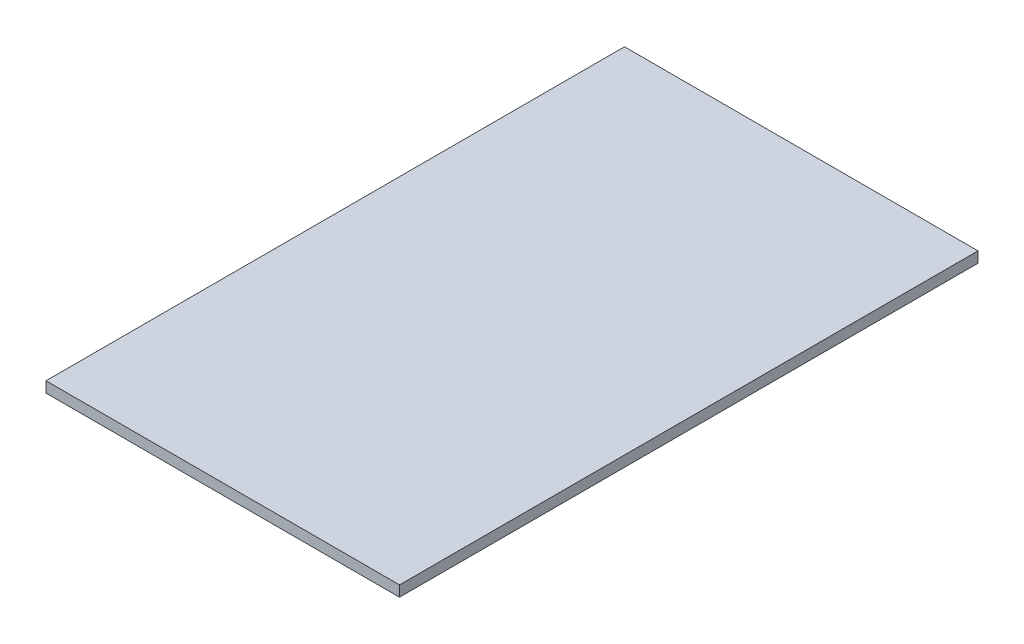
ISO-10303-21;
HEADER;
FILE_DESCRIPTION(('STEP AP214'),'2;1');
FILE_NAME('part.step','',(''),(''),'','','');
FILE_SCHEMA(('AUTOMOTIVE_DESIGN { 1 0 10303 214 1 1 1 1 }'));
ENDSEC;
DATA;
#1=APPLICATION_CONTEXT('core data for automotive mechanical design processes');
#2=APPLICATION_PROTOCOL_DEFINITION('international standard','automotive_design',2000,#1);
#3=PRODUCT_CONTEXT('',#1,'mechanical');
#4=PRODUCT('Part','Part','',(#3));
#5=PRODUCT_RELATED_PRODUCT_CATEGORY('part','',(#4));
#6=PRODUCT_DEFINITION_FORMATION('','',#4);
#7=PRODUCT_DEFINITION_CONTEXT('part definition',#1,'design');
#8=PRODUCT_DEFINITION('design','',#6,#7);
#9=PRODUCT_DEFINITION_SHAPE('','',#8);
#10=(LENGTH_UNIT() NAMED_UNIT(*) SI_UNIT(.MILLI.,.METRE.));
#11=(NAMED_UNIT(*) PLANE_ANGLE_UNIT() SI_UNIT($,.RADIAN.));
#12=(NAMED_UNIT(*) SI_UNIT($,.STERADIAN.) SOLID_ANGLE_UNIT());
#13=UNCERTAINTY_MEASURE_WITH_UNIT(LENGTH_MEASURE(1.E-05),#10,'distance_accuracy_value','');
#14=(GEOMETRIC_REPRESENTATION_CONTEXT(3) GLOBAL_UNCERTAINTY_ASSIGNED_CONTEXT((#13)) GLOBAL_UNIT_ASSIGNED_CONTEXT((#10,
#11,#12)) REPRESENTATION_CONTEXT('',''));
#15=CARTESIAN_POINT('',(0.,0.,0.));
#16=DIRECTION('',(0.,0.,1.));
#17=DIRECTION('',(1.,0.,0.));
#18=AXIS2_PLACEMENT_3D('',#15,#16,#17);
#19=CARTESIAN_POINT('',(82.5,5.,135.));
#20=DIRECTION('',(-1.,0.,0.));
#21=DIRECTION('',(0.,0.,1.));
#22=AXIS2_PLACEMENT_3D('',#19,#20,#21);
#23=PLANE('',#22);
#24=DIRECTION('',(0.,0.,-1.));
#25=VECTOR('',#24,1.);
#26=CARTESIAN_POINT('',(82.5,0.,135.));
#27=LINE('',#26,#25);
#28=CARTESIAN_POINT('',(82.5,0.,135.));
#29=VERTEX_POINT('',#28);
#30=CARTESIAN_POINT('',(82.5,0.,-135.));
#31=VERTEX_POINT('',#30);
#32=EDGE_CURVE('E102',#29,#31,#27,.T.);
#33=ORIENTED_EDGE('',*,*,#32,.T.);
#34=DIRECTION('',(0.,-1.,0.));
#35=VECTOR('',#34,1.);
#36=CARTESIAN_POINT('',(82.5,5.,-135.));
#37=LINE('',#36,#35);
#38=CARTESIAN_POINT('',(82.5,5.,-135.));
#39=VERTEX_POINT('',#38);
#40=EDGE_CURVE('E11',#39,#31,#37,.T.);
#41=ORIENTED_EDGE('',*,*,#40,.F.);
#42=DIRECTION('',(0.,0.,-1.));
#43=VECTOR('',#42,1.);
#44=CARTESIAN_POINT('',(82.5,5.,135.));
#45=LINE('',#44,#43);
#46=CARTESIAN_POINT('',(82.5,5.,135.));
#47=VERTEX_POINT('',#46);
#48=EDGE_CURVE('E90',#47,#39,#45,.T.);
#49=ORIENTED_EDGE('',*,*,#48,.F.);
#50=DIRECTION('',(0.,-1.,0.));
#51=VECTOR('',#50,1.);
#52=CARTESIAN_POINT('',(82.5,5.,135.));
#53=LINE('',#52,#51);
#54=EDGE_CURVE('E98',#47,#29,#53,.T.);
#55=ORIENTED_EDGE('',*,*,#54,.T.);
#56=EDGE_LOOP('',(#33,#41,#49,#55));
#57=FACE_BOUND('',#56,.T.);
#58=ADVANCED_FACE('F39',(#57),#23,.F.);
#59=CARTESIAN_POINT('',(-82.5,5.,-135.));
#60=DIRECTION('',(0.,0.,1.));
#61=DIRECTION('',(1.,0.,0.));
#62=AXIS2_PLACEMENT_3D('',#59,#60,#61);
#63=PLANE('',#62);
#64=DIRECTION('',(-1.,0.,0.));
#65=VECTOR('',#64,1.);
#66=CARTESIAN_POINT('',(-82.5,0.,-135.));
#67=LINE('',#66,#65);
#68=CARTESIAN_POINT('',(-82.5,0.,-135.));
#69=VERTEX_POINT('',#68);
#70=EDGE_CURVE('E94',#31,#69,#67,.T.);
#71=ORIENTED_EDGE('',*,*,#70,.T.);
#72=DIRECTION('',(0.,-1.,0.));
#73=VECTOR('',#72,1.);
#74=CARTESIAN_POINT('',(-82.5,5.,-135.));
#75=LINE('',#74,#73);
#76=CARTESIAN_POINT('',(-82.5,5.,-135.));
#77=VERTEX_POINT('',#76);
#78=EDGE_CURVE('E47',#77,#69,#75,.T.);
#79=ORIENTED_EDGE('',*,*,#78,.F.);
#80=DIRECTION('',(-1.,0.,0.));
#81=VECTOR('',#80,1.);
#82=CARTESIAN_POINT('',(-82.5,5.,-135.));
#83=LINE('',#82,#81);
#84=EDGE_CURVE('E85',#39,#77,#83,.T.);
#85=ORIENTED_EDGE('',*,*,#84,.F.);
#86=ORIENTED_EDGE('',*,*,#40,.T.);
#87=EDGE_LOOP('',(#71,#79,#85,#86));
#88=FACE_BOUND('',#87,.T.);
#89=ADVANCED_FACE('F93',(#88),#63,.F.);
#90=CARTESIAN_POINT('',(-82.5,5.,135.));
#91=DIRECTION('',(1.,0.,0.));
#92=DIRECTION('',(0.,0.,-1.));
#93=AXIS2_PLACEMENT_3D('',#90,#91,#92);
#94=PLANE('',#93);
#95=DIRECTION('',(0.,0.,1.));
#96=VECTOR('',#95,1.);
#97=CARTESIAN_POINT('',(-82.5,0.,135.));
#98=LINE('',#97,#96);
#99=CARTESIAN_POINT('',(-82.5,0.,135.));
#100=VERTEX_POINT('',#99);
#101=EDGE_CURVE('E72',#69,#100,#98,.T.);
#102=ORIENTED_EDGE('',*,*,#101,.T.);
#103=DIRECTION('',(0.,-1.,0.));
#104=VECTOR('',#103,1.);
#105=CARTESIAN_POINT('',(-82.5,5.,135.));
#106=LINE('',#105,#104);
#107=CARTESIAN_POINT('',(-82.5,5.,135.));
#108=VERTEX_POINT('',#107);
#109=EDGE_CURVE('E95',#108,#100,#106,.T.);
#110=ORIENTED_EDGE('',*,*,#109,.F.);
#111=DIRECTION('',(0.,0.,1.));
#112=VECTOR('',#111,1.);
#113=CARTESIAN_POINT('',(-82.5,5.,135.));
#114=LINE('',#113,#112);
#115=EDGE_CURVE('E88',#77,#108,#114,.T.);
#116=ORIENTED_EDGE('',*,*,#115,.F.);
#117=ORIENTED_EDGE('',*,*,#78,.T.);
#118=EDGE_LOOP('',(#102,#110,#116,#117));
#119=FACE_BOUND('',#118,.T.);
#120=ADVANCED_FACE('F96',(#119),#94,.F.);
#121=CARTESIAN_POINT('',(-82.5,5.,135.));
#122=DIRECTION('',(0.,0.,-1.));
#123=DIRECTION('',(-1.,0.,0.));
#124=AXIS2_PLACEMENT_3D('',#121,#122,#123);
#125=PLANE('',#124);
#126=DIRECTION('',(1.,0.,0.));
#127=VECTOR('',#126,1.);
#128=CARTESIAN_POINT('',(-82.5,0.,135.));
#129=LINE('',#128,#127);
#130=EDGE_CURVE('E78',#100,#29,#129,.T.);
#131=ORIENTED_EDGE('',*,*,#130,.T.);
#132=ORIENTED_EDGE('',*,*,#54,.F.);
#133=DIRECTION('',(1.,0.,0.));
#134=VECTOR('',#133,1.);
#135=CARTESIAN_POINT('',(-82.5,5.,135.));
#136=LINE('',#135,#134);
#137=EDGE_CURVE('E55',#108,#47,#136,.T.);
#138=ORIENTED_EDGE('',*,*,#137,.F.);
#139=ORIENTED_EDGE('',*,*,#109,.T.);
#140=EDGE_LOOP('',(#131,#132,#138,#139));
#141=FACE_BOUND('',#140,.T.);
#142=ADVANCED_FACE('F109',(#141),#125,.F.);
#143=CARTESIAN_POINT('',(0.,5.,0.));
#144=DIRECTION('',(0.,-1.,0.));
#145=DIRECTION('',(0.,0.,-1.));
#146=AXIS2_PLACEMENT_3D('',#143,#144,#145);
#147=PLANE('',#146);
#148=ORIENTED_EDGE('',*,*,#48,.T.);
#149=ORIENTED_EDGE('',*,*,#84,.T.);
#150=ORIENTED_EDGE('',*,*,#115,.T.);
#151=ORIENTED_EDGE('',*,*,#137,.T.);
#152=EDGE_LOOP('',(#148,#149,#150,#151));
#153=FACE_BOUND('',#152,.T.);
#154=ADVANCED_FACE('F86',(#153),#147,.F.);
#155=CARTESIAN_POINT('',(0.,0.,0.));
#156=DIRECTION('',(0.,-1.,0.));
#157=DIRECTION('',(0.,0.,-1.));
#158=AXIS2_PLACEMENT_3D('',#155,#156,#157);
#159=PLANE('',#158);
#160=ORIENTED_EDGE('',*,*,#32,.F.);
#161=ORIENTED_EDGE('',*,*,#130,.F.);
#162=ORIENTED_EDGE('',*,*,#101,.F.);
#163=ORIENTED_EDGE('',*,*,#70,.F.);
#164=EDGE_LOOP('',(#160,#161,#162,#163));
#165=FACE_BOUND('',#164,.T.);
#166=ADVANCED_FACE('F112',(#165),#159,.T.);
#167=CLOSED_SHELL('',(#58,#89,#120,#142,#154,#166));
#168=MANIFOLD_SOLID_BREP('B2',#167);
#169=ADVANCED_BREP_SHAPE_REPRESENTATION('',(#18,#168),#14);
#170=SHAPE_DEFINITION_REPRESENTATION(#9,#169);
ENDSEC;
END-ISO-10303-21;
